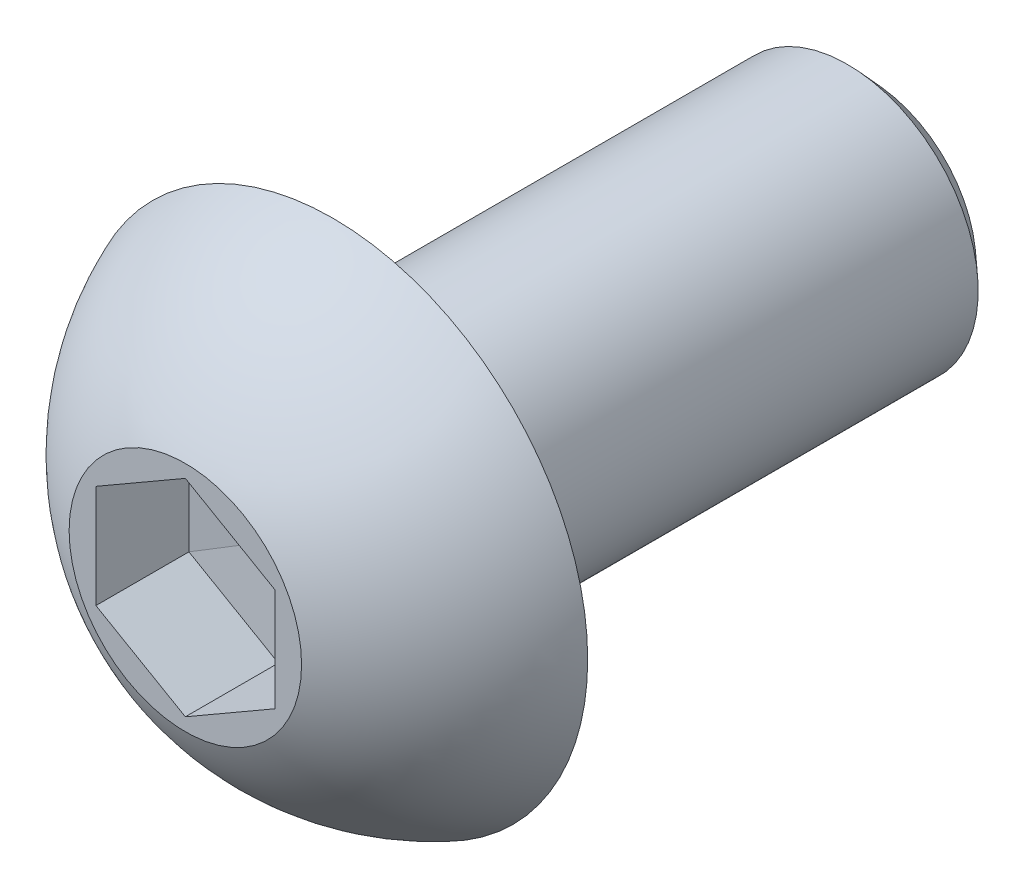
ISO-10303-21;
HEADER;
FILE_DESCRIPTION(('STEP AP214'),'2;1');
FILE_NAME('part.step','',(''),(''),'','','');
FILE_SCHEMA(('AUTOMOTIVE_DESIGN { 1 0 10303 214 1 1 1 1 }'));
ENDSEC;
DATA;
#1=APPLICATION_CONTEXT('core data for automotive mechanical design processes');
#2=APPLICATION_PROTOCOL_DEFINITION('international standard','automotive_design',2000,#1);
#3=PRODUCT_CONTEXT('',#1,'mechanical');
#4=PRODUCT('Part','Part','',(#3));
#5=PRODUCT_RELATED_PRODUCT_CATEGORY('part','',(#4));
#6=PRODUCT_DEFINITION_FORMATION('','',#4);
#7=PRODUCT_DEFINITION_CONTEXT('part definition',#1,'design');
#8=PRODUCT_DEFINITION('design','',#6,#7);
#9=PRODUCT_DEFINITION_SHAPE('','',#8);
#10=(LENGTH_UNIT() NAMED_UNIT(*) SI_UNIT(.MILLI.,.METRE.));
#11=(NAMED_UNIT(*) PLANE_ANGLE_UNIT() SI_UNIT($,.RADIAN.));
#12=(NAMED_UNIT(*) SI_UNIT($,.STERADIAN.) SOLID_ANGLE_UNIT());
#13=UNCERTAINTY_MEASURE_WITH_UNIT(LENGTH_MEASURE(1.E-05),#10,'distance_accuracy_value','');
#14=(GEOMETRIC_REPRESENTATION_CONTEXT(3) GLOBAL_UNCERTAINTY_ASSIGNED_CONTEXT((#13)) GLOBAL_UNIT_ASSIGNED_CONTEXT((#10,
#11,#12)) REPRESENTATION_CONTEXT('',''));
#15=CARTESIAN_POINT('',(0.,0.,0.));
#16=DIRECTION('',(0.,0.,1.));
#17=DIRECTION('',(1.,0.,0.));
#18=AXIS2_PLACEMENT_3D('',#15,#16,#17);
#19=CARTESIAN_POINT('',(0.,0.,-1.12424242424294));
#20=DIRECTION('',(0.,0.,1.));
#21=DIRECTION('',(1.,0.,0.));
#22=AXIS2_PLACEMENT_3D('',#19,#20,#21);
#23=SPHERICAL_SURFACE('',#22,3.06372665694355);
#24=CARTESIAN_POINT('',(0.,0.,-5.09960734214414E-13));
#25=DIRECTION('',(0.,0.,-1.));
#26=DIRECTION('',(1.,0.,0.));
#27=AXIS2_PLACEMENT_3D('',#24,#25,#26);
#28=CIRCLE('',#27,2.85);
#29=CARTESIAN_POINT('',(2.85,0.,-5.10659223240673E-13));
#30=VERTEX_POINT('',#29);
#31=EDGE_CURVE('E146',#30,#30,#28,.T.);
#32=CARTESIAN_POINT('',(0.,0.,1.64999999999949));
#33=DIRECTION('',(0.,0.,-1.));
#34=DIRECTION('',(1.,0.,0.));
#35=AXIS2_PLACEMENT_3D('',#32,#33,#34);
#36=CIRCLE('',#35,1.3);
#37=CARTESIAN_POINT('',(1.3,0.,1.64999999999949));
#38=VERTEX_POINT('',#37);
#39=EDGE_CURVE('E11',#38,#38,#36,.T.);
#40=CARTESIAN_POINT('',(2.85,0.,-5.10659223240673E-13));
#41=CARTESIAN_POINT('',(2.84113663386439,0.,0.0224691478443114));
#42=CARTESIAN_POINT('',(2.83200744713934,0.,0.0448334346416591));
#43=CARTESIAN_POINT('',(2.81322277135795,0.,0.0893398740639242));
#44=CARTESIAN_POINT('',(2.80356728230162,0.,0.111482026688841));
#45=CARTESIAN_POINT('',(2.7837353407053,0.,0.155531785688763));
#46=CARTESIAN_POINT('',(2.77355888816531,0.,0.177439392063768));
#47=CARTESIAN_POINT('',(2.75269072874913,0.,0.221007810980761));
#48=CARTESIAN_POINT('',(2.74199902187295,0.,0.24266862352275));
#49=CARTESIAN_POINT('',(2.7201063300164,0.,0.285731336320252));
#50=CARTESIAN_POINT('',(2.70890534503602,0.,0.307133236575766));
#51=CARTESIAN_POINT('',(2.68600036374538,0.,0.349666153566971));
#52=CARTESIAN_POINT('',(2.67429636743511,0.,0.370797170302663));
#53=CARTESIAN_POINT('',(2.65039191011457,0.,0.412776499906466));
#54=CARTESIAN_POINT('',(2.63819144910429,0.,0.433624812774579));
#55=CARTESIAN_POINT('',(2.61330088713136,0.,0.475027072605241));
#56=CARTESIAN_POINT('',(2.6006107861687,0.,0.495581019567789));
#57=CARTESIAN_POINT('',(2.57474804282317,0.,0.536383050164972));
#58=CARTESIAN_POINT('',(2.56157540044031,0.,0.556631133799606));
#59=CARTESIAN_POINT('',(2.53475494273848,0.,0.596810111423956));
#60=CARTESIAN_POINT('',(2.52110712741952,0.,0.616741005413671));
#61=CARTESIAN_POINT('',(2.49334395812279,0.,0.656274454856581));
#62=CARTESIAN_POINT('',(2.47922860414502,0.,0.675877010309776));
#63=CARTESIAN_POINT('',(2.45053825334057,0.,0.714742817454075));
#64=CARTESIAN_POINT('',(2.4359632565139,0.,0.734006069145179));
#65=CARTESIAN_POINT('',(2.40636177293482,0.,0.772182493338329));
#66=CARTESIAN_POINT('',(2.3913352861824,0.,0.791095665840376));
#67=CARTESIAN_POINT('',(2.36083922822839,0.,0.828561352054885));
#68=CARTESIAN_POINT('',(2.34536965702678,0.,0.847113865767347));
#69=CARTESIAN_POINT('',(2.31399608350231,0.,0.883847856546503));
#70=CARTESIAN_POINT('',(2.29809208117944,0.,0.902029333613197));
#71=CARTESIAN_POINT('',(2.2658585417513,0.,0.938011080794139));
#72=CARTESIAN_POINT('',(2.24952900464603,0.,0.955811350908387));
#73=CARTESIAN_POINT('',(2.21645353002648,0.,0.991020727116296));
#74=CARTESIAN_POINT('',(2.1997075925122,0.,1.00842983320996));
#75=CARTESIAN_POINT('',(2.16580868437298,0.,1.04284714311685));
#76=CARTESIAN_POINT('',(2.14865571374804,0.,1.05985534693008));
#77=CARTESIAN_POINT('',(2.11395233437096,0.,1.09346133827194));
#78=CARTESIAN_POINT('',(2.09640192561881,0.,1.11005912580056));
#79=CARTESIAN_POINT('',(2.06091348728868,0.,1.14283500014659));
#80=CARTESIAN_POINT('',(2.04297545771069,0.,1.15901308696401));
#81=CARTESIAN_POINT('',(2.00672181185651,0.,1.19094051023207));
#82=CARTESIAN_POINT('',(1.98840619558033,0.,1.20668984668272));
#83=CARTESIAN_POINT('',(1.95140762167093,0.,1.23775095939509));
#84=CARTESIAN_POINT('',(1.93272466403772,0.,1.25306273565682));
#85=CARTESIAN_POINT('',(1.89500185823761,0.,1.28324016292989));
#86=CARTESIAN_POINT('',(1.87596201007072,0.,1.29810581394125));
#87=CARTESIAN_POINT('',(1.83753607366409,0.,1.32738267520654));
#88=CARTESIAN_POINT('',(1.81814998542436,0.,1.34179388546048));
#89=CARTESIAN_POINT('',(1.77904241300796,0.,1.37015380390018));
#90=CARTESIAN_POINT('',(1.7593209288313,0.,1.38410251208594));
#91=CARTESIAN_POINT('',(1.71955359630399,0.,1.41152962382006));
#92=CARTESIAN_POINT('',(1.69950774795333,0.,1.42500802736843));
#93=CARTESIAN_POINT('',(1.65910290023023,0.,1.45148699023043));
#94=CARTESIAN_POINT('',(1.63874390085779,0.,1.46448754954408));
#95=CARTESIAN_POINT('',(1.59772413960959,0.,1.4900035520297));
#96=CARTESIAN_POINT('',(1.57706337773384,0.,1.50251899520168));
#97=CARTESIAN_POINT('',(1.5354516480626,0.,1.52705776338538));
#98=CARTESIAN_POINT('',(1.5145006802671,0.,1.53908108839711));
#99=CARTESIAN_POINT('',(1.47232026041398,0.,1.56262889902485));
#100=CARTESIAN_POINT('',(1.45109080835635,0.,1.57415338464086));
#101=CARTESIAN_POINT('',(1.40836528719074,0.,1.59669705374236));
#102=CARTESIAN_POINT('',(1.38686921808275,0.,1.60771623722784));
#103=CARTESIAN_POINT('',(1.34362251732278,0.,1.62924319863992));
#104=CARTESIAN_POINT('',(1.3218718856708,0.,1.63975097656652));
#105=CARTESIAN_POINT('',(1.3,0.,1.64999999999949));
#106=B_SPLINE_CURVE_WITH_KNOTS('',3,(#40,#41,#42,#43,#44,#45,#46,#47,#48,#49,#50,#51,#52,#53,
#54,#55,#56,#57,#58,#59,#60,#61,#62,#63,#64,#65,#66,#67,#68,#69,#70,#71,#72,#73,#74,#75,#76,#77,
#78,#79,#80,#81,#82,#83,#84,#85,#86,#87,#88,#89,#90,#91,#92,#93,#94,#95,#96,#97,#98,#99,#100,
#101,#102,#103,#104,#105),.UNSPECIFIED.,.F.,.F.,(4,2,2,2,2,2,2,2,2,2,2,2,2,2,2,2,2,2,2,2,2,2,2,
2,2,2,2,2,2,2,2,2,4),(0.,0.0724606888856509,0.144921377771302,0.217382066656953,
0.289842755542604,0.362303444428255,0.434764133313906,0.507224822199557,0.579685511085209,
0.652146199970859,0.72460688885651,0.797067577742162,0.869528266627813,0.941988955513463,
1.01444964439911,1.08691033328477,1.15937102217042,1.23183171105607,1.30429239994172,
1.37675308882737,1.44921377771302,1.52167446659867,1.59413515548432,1.66659584436997,
1.73905653325563,1.81151722214128,1.88397791102693,1.95643859991258,2.02889928879823,
2.10135997768388,2.17382066656953,2.24628135545518,2.31874204434083),.UNSPECIFIED.);
#107=EDGE_CURVE('BSEAM17',#30,#38,#106,.T.);
#108=ORIENTED_EDGE('',*,*,#31,.F.);
#109=ORIENTED_EDGE('',*,*,#39,.T.);
#110=ORIENTED_EDGE('',*,*,#107,.T.);
#111=ORIENTED_EDGE('',*,*,#107,.F.);
#112=EDGE_LOOP('',(#108,#110,#109,#111));
#113=FACE_BOUND('',#112,.T.);
#114=ADVANCED_FACE('F17',(#113),#23,.T.);
#115=CARTESIAN_POINT('',(-1.3,0.,1.64999999999949));
#116=DIRECTION('',(0.,0.,1.));
#117=DIRECTION('',(1.,0.,0.));
#118=AXIS2_PLACEMENT_3D('',#115,#116,#117);
#119=PLANE('',#118);
#120=DIRECTION('',(-0.866025403784439,-0.5,0.));
#121=VECTOR('',#120,1.);
#122=CARTESIAN_POINT('',(0.2625,-1.00314609271698,1.64999999999949));
#123=LINE('',#122,#121);
#124=CARTESIAN_POINT('',(1.,-0.577350269189626,1.65));
#125=VERTEX_POINT('',#124);
#126=CARTESIAN_POINT('',(0.,-1.15470053837925,1.65));
#127=VERTEX_POINT('',#126);
#128=EDGE_CURVE('E165',#125,#127,#123,.T.);
#129=ORIENTED_EDGE('',*,*,#128,.T.);
#130=DIRECTION('',(-0.866025403784439,0.5,0.));
#131=VECTOR('',#130,1.);
#132=CARTESIAN_POINT('',(-0.7375,-0.728904714851902,1.64999999999949));
#133=LINE('',#132,#131);
#134=CARTESIAN_POINT('',(-1.,-0.577350269189625,1.65));
#135=VERTEX_POINT('',#134);
#136=EDGE_CURVE('E20',#127,#135,#133,.T.);
#137=ORIENTED_EDGE('',*,*,#136,.T.);
#138=DIRECTION('',(0.,1.,0.));
#139=VECTOR('',#138,1.);
#140=CARTESIAN_POINT('',(-1.,-0.288675134594813,1.64999999999949));
#141=LINE('',#140,#139);
#142=CARTESIAN_POINT('',(-1.,0.577350269189626,1.65));
#143=VERTEX_POINT('',#142);
#144=EDGE_CURVE('E44',#135,#143,#141,.T.);
#145=ORIENTED_EDGE('',*,*,#144,.T.);
#146=DIRECTION('',(0.866025403784439,0.5,0.));
#147=VECTOR('',#146,1.);
#148=CARTESIAN_POINT('',(-1.2375,0.44022958025709,1.64999999999949));
#149=LINE('',#148,#147);
#150=CARTESIAN_POINT('',(0.,1.15470053837925,1.65));
#151=VERTEX_POINT('',#150);
#152=EDGE_CURVE('E186',#143,#151,#149,.T.);
#153=ORIENTED_EDGE('',*,*,#152,.T.);
#154=DIRECTION('',(0.866025403784439,-0.5,0.));
#155=VECTOR('',#154,1.);
#156=CARTESIAN_POINT('',(-0.2375,1.29182122731179,1.64999999999949));
#157=LINE('',#156,#155);
#158=CARTESIAN_POINT('',(1.,0.577350269189626,1.65));
#159=VERTEX_POINT('',#158);
#160=EDGE_CURVE('E180',#151,#159,#157,.T.);
#161=ORIENTED_EDGE('',*,*,#160,.T.);
#162=DIRECTION('',(0.,-1.,0.));
#163=VECTOR('',#162,1.);
#164=CARTESIAN_POINT('',(1.,0.288675134594813,1.64999999999949));
#165=LINE('',#164,#163);
#166=EDGE_CURVE('E174',#159,#125,#165,.T.);
#167=ORIENTED_EDGE('',*,*,#166,.T.);
#168=EDGE_LOOP('',(#129,#137,#145,#153,#161,#167));
#169=FACE_BOUND('',#168,.T.);
#170=ORIENTED_EDGE('',*,*,#39,.F.);
#171=EDGE_LOOP('',(#170));
#172=FACE_BOUND('',#171,.T.);
#173=ADVANCED_FACE('F379',(#169,#172),#119,.T.);
#174=CARTESIAN_POINT('',(0.,0.,-6.));
#175=DIRECTION('',(0.,0.,-1.));
#176=DIRECTION('',(-1.,0.,0.));
#177=AXIS2_PLACEMENT_3D('',#174,#175,#176);
#178=PLANE('',#177);
#179=CARTESIAN_POINT('',(0.,0.,-6.));
#180=DIRECTION('',(0.,0.,-1.));
#181=DIRECTION('',(-1.,0.,0.));
#182=AXIS2_PLACEMENT_3D('',#179,#180,#181);
#183=CIRCLE('',#182,1.193275);
#184=CARTESIAN_POINT('',(-1.193275,0.,-6.));
#185=VERTEX_POINT('',#184);
#186=EDGE_CURVE('E452',#185,#185,#183,.T.);
#187=ORIENTED_EDGE('',*,*,#186,.T.);
#188=EDGE_LOOP('',(#187));
#189=FACE_BOUND('',#188,.T.);
#190=ADVANCED_FACE('F368',(#189),#178,.T.);
#191=CARTESIAN_POINT('',(0.,-1.15470053837925,1.65));
#192=DIRECTION('',(-0.5,-0.866025403784439,0.));
#193=DIRECTION('',(-0.866025403784439,0.5,0.));
#194=AXIS2_PLACEMENT_3D('',#191,#192,#193);
#195=PLANE('',#194);
#196=ORIENTED_EDGE('',*,*,#136,.F.);
#197=DIRECTION('',(0.,0.,-1.));
#198=VECTOR('',#197,1.);
#199=CARTESIAN_POINT('',(0.,-1.15470053837925,1.65));
#200=LINE('',#199,#198);
#201=CARTESIAN_POINT('',(0.,-1.15470053837925,0.61));
#202=VERTEX_POINT('',#201);
#203=EDGE_CURVE('E171',#127,#202,#200,.T.);
#204=ORIENTED_EDGE('',*,*,#203,.T.);
#205=DIRECTION('',(-0.866025403784439,0.5,0.));
#206=VECTOR('',#205,1.);
#207=CARTESIAN_POINT('',(-1.,-0.577350269189625,0.61));
#208=LINE('',#207,#206);
#209=CARTESIAN_POINT('',(-1.,-0.577350269189625,0.61));
#210=VERTEX_POINT('',#209);
#211=EDGE_CURVE('E103',#202,#210,#208,.T.);
#212=ORIENTED_EDGE('',*,*,#211,.T.);
#213=DIRECTION('',(0.,0.,-1.));
#214=VECTOR('',#213,1.);
#215=CARTESIAN_POINT('',(-1.,-0.577350269189625,1.65));
#216=LINE('',#215,#214);
#217=EDGE_CURVE('E193',#135,#210,#216,.T.);
#218=ORIENTED_EDGE('',*,*,#217,.F.);
#219=EDGE_LOOP('',(#196,#204,#212,#218));
#220=FACE_BOUND('',#219,.T.);
#221=ADVANCED_FACE('F358',(#220),#195,.F.);
#222=CARTESIAN_POINT('',(-1.,-0.577350269189625,1.65));
#223=DIRECTION('',(-1.,0.,0.));
#224=DIRECTION('',(0.,0.,1.));
#225=AXIS2_PLACEMENT_3D('',#222,#223,#224);
#226=PLANE('',#225);
#227=ORIENTED_EDGE('',*,*,#144,.F.);
#228=ORIENTED_EDGE('',*,*,#217,.T.);
#229=DIRECTION('',(0.,1.,0.));
#230=VECTOR('',#229,1.);
#231=CARTESIAN_POINT('',(-1.,0.577350269189626,0.61));
#232=LINE('',#231,#230);
#233=CARTESIAN_POINT('',(-1.,0.577350269189626,0.61));
#234=VERTEX_POINT('',#233);
#235=EDGE_CURVE('E98',#210,#234,#232,.T.);
#236=ORIENTED_EDGE('',*,*,#235,.T.);
#237=DIRECTION('',(0.,0.,-1.));
#238=VECTOR('',#237,1.);
#239=CARTESIAN_POINT('',(-1.,0.577350269189626,1.65));
#240=LINE('',#239,#238);
#241=EDGE_CURVE('E189',#143,#234,#240,.T.);
#242=ORIENTED_EDGE('',*,*,#241,.F.);
#243=EDGE_LOOP('',(#227,#228,#236,#242));
#244=FACE_BOUND('',#243,.T.);
#245=ADVANCED_FACE('F348',(#244),#226,.F.);
#246=CARTESIAN_POINT('',(-1.,0.577350269189626,1.65));
#247=DIRECTION('',(-0.5,0.866025403784439,0.));
#248=DIRECTION('',(0.,0.,1.));
#249=AXIS2_PLACEMENT_3D('',#246,#247,#248);
#250=PLANE('',#249);
#251=ORIENTED_EDGE('',*,*,#152,.F.);
#252=ORIENTED_EDGE('',*,*,#241,.T.);
#253=DIRECTION('',(0.866025403784439,0.5,0.));
#254=VECTOR('',#253,1.);
#255=CARTESIAN_POINT('',(0.,1.15470053837925,0.61));
#256=LINE('',#255,#254);
#257=CARTESIAN_POINT('',(0.,1.15470053837925,0.61));
#258=VERTEX_POINT('',#257);
#259=EDGE_CURVE('E112',#234,#258,#256,.T.);
#260=ORIENTED_EDGE('',*,*,#259,.T.);
#261=DIRECTION('',(0.,0.,-1.));
#262=VECTOR('',#261,1.);
#263=CARTESIAN_POINT('',(0.,1.15470053837925,1.65));
#264=LINE('',#263,#262);
#265=EDGE_CURVE('E183',#151,#258,#264,.T.);
#266=ORIENTED_EDGE('',*,*,#265,.F.);
#267=EDGE_LOOP('',(#251,#252,#260,#266));
#268=FACE_BOUND('',#267,.T.);
#269=ADVANCED_FACE('F337',(#268),#250,.F.);
#270=CARTESIAN_POINT('',(0.,1.15470053837925,1.65));
#271=DIRECTION('',(0.5,0.866025403784439,0.));
#272=DIRECTION('',(0.,0.,-1.));
#273=AXIS2_PLACEMENT_3D('',#270,#271,#272);
#274=PLANE('',#273);
#275=ORIENTED_EDGE('',*,*,#160,.F.);
#276=ORIENTED_EDGE('',*,*,#265,.T.);
#277=DIRECTION('',(0.866025403784439,-0.5,0.));
#278=VECTOR('',#277,1.);
#279=CARTESIAN_POINT('',(1.,0.577350269189626,0.61));
#280=LINE('',#279,#278);
#281=CARTESIAN_POINT('',(1.,0.577350269189626,0.61));
#282=VERTEX_POINT('',#281);
#283=EDGE_CURVE('E122',#258,#282,#280,.T.);
#284=ORIENTED_EDGE('',*,*,#283,.T.);
#285=DIRECTION('',(0.,0.,-1.));
#286=VECTOR('',#285,1.);
#287=CARTESIAN_POINT('',(1.,0.577350269189626,1.65));
#288=LINE('',#287,#286);
#289=EDGE_CURVE('E177',#159,#282,#288,.T.);
#290=ORIENTED_EDGE('',*,*,#289,.F.);
#291=EDGE_LOOP('',(#275,#276,#284,#290));
#292=FACE_BOUND('',#291,.T.);
#293=ADVANCED_FACE('F326',(#292),#274,.F.);
#294=CARTESIAN_POINT('',(1.,0.577350269189626,1.65));
#295=DIRECTION('',(1.,0.,0.));
#296=DIRECTION('',(0.,1.,0.));
#297=AXIS2_PLACEMENT_3D('',#294,#295,#296);
#298=PLANE('',#297);
#299=ORIENTED_EDGE('',*,*,#166,.F.);
#300=ORIENTED_EDGE('',*,*,#289,.T.);
#301=DIRECTION('',(0.,-1.,0.));
#302=VECTOR('',#301,1.);
#303=CARTESIAN_POINT('',(1.,-0.577350269189626,0.61));
#304=LINE('',#303,#302);
#305=CARTESIAN_POINT('',(1.,-0.577350269189626,0.61));
#306=VERTEX_POINT('',#305);
#307=EDGE_CURVE('E132',#282,#306,#304,.T.);
#308=ORIENTED_EDGE('',*,*,#307,.T.);
#309=DIRECTION('',(0.,0.,-1.));
#310=VECTOR('',#309,1.);
#311=CARTESIAN_POINT('',(1.,-0.577350269189626,1.65));
#312=LINE('',#311,#310);
#313=EDGE_CURVE('E168',#125,#306,#312,.T.);
#314=ORIENTED_EDGE('',*,*,#313,.F.);
#315=EDGE_LOOP('',(#299,#300,#308,#314));
#316=FACE_BOUND('',#315,.T.);
#317=ADVANCED_FACE('F316',(#316),#298,.F.);
#318=CARTESIAN_POINT('',(1.,-0.577350269189626,1.65));
#319=DIRECTION('',(0.5,-0.866025403784439,0.));
#320=DIRECTION('',(0.,0.,-1.));
#321=AXIS2_PLACEMENT_3D('',#318,#319,#320);
#322=PLANE('',#321);
#323=ORIENTED_EDGE('',*,*,#128,.F.);
#324=ORIENTED_EDGE('',*,*,#313,.T.);
#325=DIRECTION('',(-0.866025403784439,-0.5,0.));
#326=VECTOR('',#325,1.);
#327=CARTESIAN_POINT('',(0.,-1.15470053837925,0.61));
#328=LINE('',#327,#326);
#329=EDGE_CURVE('E140',#306,#202,#328,.T.);
#330=ORIENTED_EDGE('',*,*,#329,.T.);
#331=ORIENTED_EDGE('',*,*,#203,.F.);
#332=EDGE_LOOP('',(#323,#324,#330,#331));
#333=FACE_BOUND('',#332,.T.);
#334=ADVANCED_FACE('F306',(#333),#322,.F.);
#335=CARTESIAN_POINT('',(-1.,-0.577350269189625,0.61));
#336=DIRECTION('',(-0.0435778713738291,-0.0754790873051733,-0.996194698091746));
#337=DIRECTION('',(0.,-0.997141949694317,0.0755508581011305));
#338=AXIS2_PLACEMENT_3D('',#335,#336,#337);
#339=PLANE('',#338);
#340=DIRECTION('',(0.863550259614423,0.498570974847158,-0.0755508581011305));
#341=VECTOR('',#340,1.);
#342=CARTESIAN_POINT('',(-0.751426983039954,-0.433836570934465,0.588252678957559));
#343=LINE('',#342,#341);
#344=CARTESIAN_POINT('',(0.,0.,0.522511336474076));
#345=VERTEX_POINT('',#344);
#346=EDGE_CURVE('E92',#210,#345,#343,.T.);
#347=ORIENTED_EDGE('',*,*,#346,.F.);
#348=ORIENTED_EDGE('',*,*,#211,.F.);
#349=DIRECTION('',(0.,0.997141949694317,-0.0755508581011306));
#350=VECTOR('',#349,1.);
#351=CARTESIAN_POINT('',(0.,-0.867673141868932,0.588252678957559));
#352=LINE('',#351,#350);
#353=EDGE_CURVE('E138',#202,#345,#352,.T.);
#354=ORIENTED_EDGE('',*,*,#353,.T.);
#355=EDGE_LOOP('',(#347,#348,#354));
#356=FACE_BOUND('',#355,.T.);
#357=ADVANCED_FACE('F143',(#356),#339,.F.);
#358=CARTESIAN_POINT('',(-1.,0.577350269189626,0.61));
#359=DIRECTION('',(-0.0871557427476581,0.,-0.996194698091746));
#360=DIRECTION('',(-0.996194698091746,0.,0.0871557427476581));
#361=AXIS2_PLACEMENT_3D('',#358,#359,#360);
#362=PLANE('',#361);
#363=DIRECTION('',(0.863550259614423,-0.498570974847159,-0.0755508581011305));
#364=VECTOR('',#363,1.);
#365=CARTESIAN_POINT('',(-0.751426983039954,0.433836570934466,0.588252678957559));
#366=LINE('',#365,#364);
#367=EDGE_CURVE('E95',#234,#345,#366,.T.);
#368=ORIENTED_EDGE('',*,*,#367,.F.);
#369=ORIENTED_EDGE('',*,*,#235,.F.);
#370=ORIENTED_EDGE('',*,*,#346,.T.);
#371=EDGE_LOOP('',(#368,#369,#370));
#372=FACE_BOUND('',#371,.T.);
#373=ADVANCED_FACE('F94',(#372),#362,.F.);
#374=CARTESIAN_POINT('',(0.,1.15470053837925,0.61));
#375=DIRECTION('',(-0.0435778713738291,0.0754790873051733,-0.996194698091746));
#376=DIRECTION('',(-0.999044587684655,0.,0.0437025378896691));
#377=AXIS2_PLACEMENT_3D('',#374,#375,#376);
#378=PLANE('',#377);
#379=DIRECTION('',(0.,-0.997141949694317,-0.0755508581011306));
#380=VECTOR('',#379,1.);
#381=CARTESIAN_POINT('',(0.,0.867673141868932,0.588252678957559));
#382=LINE('',#381,#380);
#383=EDGE_CURVE('E109',#258,#345,#382,.T.);
#384=ORIENTED_EDGE('',*,*,#383,.F.);
#385=ORIENTED_EDGE('',*,*,#259,.F.);
#386=ORIENTED_EDGE('',*,*,#367,.T.);
#387=EDGE_LOOP('',(#384,#385,#386));
#388=FACE_BOUND('',#387,.T.);
#389=ADVANCED_FACE('F108',(#388),#378,.F.);
#390=CARTESIAN_POINT('',(1.,0.577350269189626,0.61));
#391=DIRECTION('',(0.0435778713738291,0.0754790873051733,-0.996194698091746));
#392=DIRECTION('',(-0.999044587684655,0.,-0.0437025378896691));
#393=AXIS2_PLACEMENT_3D('',#390,#391,#392);
#394=PLANE('',#393);
#395=DIRECTION('',(-0.863550259614423,-0.498570974847158,-0.0755508581011305));
#396=VECTOR('',#395,1.);
#397=CARTESIAN_POINT('',(0.751426983039954,0.433836570934466,0.588252678957559));
#398=LINE('',#397,#396);
#399=EDGE_CURVE('E119',#282,#345,#398,.T.);
#400=ORIENTED_EDGE('',*,*,#399,.F.);
#401=ORIENTED_EDGE('',*,*,#283,.F.);
#402=ORIENTED_EDGE('',*,*,#383,.T.);
#403=EDGE_LOOP('',(#400,#401,#402));
#404=FACE_BOUND('',#403,.T.);
#405=ADVANCED_FACE('F118',(#404),#394,.F.);
#406=CARTESIAN_POINT('',(1.,-0.577350269189626,0.61));
#407=DIRECTION('',(0.0871557427476581,0.,-0.996194698091746));
#408=DIRECTION('',(0.,-1.,0.));
#409=AXIS2_PLACEMENT_3D('',#406,#407,#408);
#410=PLANE('',#409);
#411=DIRECTION('',(-0.863550259614423,0.498570974847158,-0.0755508581011305));
#412=VECTOR('',#411,1.);
#413=CARTESIAN_POINT('',(0.751426983039954,-0.433836570934466,0.588252678957559));
#414=LINE('',#413,#412);
#415=EDGE_CURVE('E129',#306,#345,#414,.T.);
#416=ORIENTED_EDGE('',*,*,#415,.F.);
#417=ORIENTED_EDGE('',*,*,#307,.F.);
#418=ORIENTED_EDGE('',*,*,#399,.T.);
#419=EDGE_LOOP('',(#416,#417,#418));
#420=FACE_BOUND('',#419,.T.);
#421=ADVANCED_FACE('F128',(#420),#410,.F.);
#422=CARTESIAN_POINT('',(0.,-1.15470053837925,0.61));
#423=DIRECTION('',(0.0435778713738291,-0.0754790873051733,-0.996194698091746));
#424=DIRECTION('',(0.,-0.997141949694317,0.0755508581011305));
#425=AXIS2_PLACEMENT_3D('',#422,#423,#424);
#426=PLANE('',#425);
#427=ORIENTED_EDGE('',*,*,#353,.F.);
#428=ORIENTED_EDGE('',*,*,#329,.F.);
#429=ORIENTED_EDGE('',*,*,#415,.T.);
#430=EDGE_LOOP('',(#427,#428,#429));
#431=FACE_BOUND('',#430,.T.);
#432=ADVANCED_FACE('F137',(#431),#426,.F.);
#433=CARTESIAN_POINT('',(0.,0.,-3.00000000000011));
#434=DIRECTION('',(0.,0.,-1.));
#435=DIRECTION('',(-1.,0.,0.));
#436=AXIS2_PLACEMENT_3D('',#433,#434,#435);
#437=CYLINDRICAL_SURFACE('',#436,1.4635);
#438=CARTESIAN_POINT('',(0.,0.,-0.300000000000217));
#439=DIRECTION('',(0.,0.,1.));
#440=DIRECTION('',(-1.,0.,0.));
#441=AXIS2_PLACEMENT_3D('',#438,#439,#440);
#442=CIRCLE('',#441,1.4635);
#443=CARTESIAN_POINT('',(-1.4635,0.,-0.300000000000217));
#444=VERTEX_POINT('',#443);
#445=EDGE_CURVE('E155',#444,#444,#442,.T.);
#446=ORIENTED_EDGE('',*,*,#445,.F.);
#447=EDGE_LOOP('',(#446));
#448=FACE_BOUND('',#447,.T.);
#449=CARTESIAN_POINT('',(0.,0.,-5.75385028398538));
#450=DIRECTION('',(0.,0.,1.));
#451=DIRECTION('',(-1.,0.,0.));
#452=AXIS2_PLACEMENT_3D('',#449,#450,#451);
#453=CIRCLE('',#452,1.4635);
#454=CARTESIAN_POINT('',(-1.4635,0.,-5.75385028398538));
#455=VERTEX_POINT('',#454);
#456=EDGE_CURVE('E472',#455,#455,#453,.T.);
#457=ORIENTED_EDGE('',*,*,#456,.T.);
#458=EDGE_LOOP('',(#457));
#459=FACE_BOUND('',#458,.T.);
#460=ADVANCED_FACE('F239',(#448,#459),#437,.T.);
#461=CARTESIAN_POINT('',(-1.5,0.,-2.17010089795198E-13));
#462=DIRECTION('',(0.,0.,-1.));
#463=DIRECTION('',(-1.,0.,0.));
#464=AXIS2_PLACEMENT_3D('',#461,#462,#463);
#465=PLANE('',#464);
#466=CARTESIAN_POINT('',(0.,0.,-2.17430240478933E-13));
#467=DIRECTION('',(0.,0.,-1.));
#468=DIRECTION('',(-1.,0.,0.));
#469=AXIS2_PLACEMENT_3D('',#466,#467,#468);
#470=CIRCLE('',#469,1.7635);
#471=CARTESIAN_POINT('',(-1.7635,0.,-2.16944690426707E-13));
#472=VERTEX_POINT('',#471);
#473=EDGE_CURVE('E459',#472,#472,#470,.T.);
#474=ORIENTED_EDGE('',*,*,#473,.F.);
#475=EDGE_LOOP('',(#474));
#476=FACE_BOUND('',#475,.T.);
#477=ORIENTED_EDGE('',*,*,#31,.T.);
#478=EDGE_LOOP('',(#477));
#479=FACE_BOUND('',#478,.T.);
#480=ADVANCED_FACE('F228',(#476,#479),#465,.T.);
#481=CARTESIAN_POINT('',(0.,0.,-0.300000000000217));
#482=DIRECTION('',(0.,0.,-1.));
#483=DIRECTION('',(-1.,0.,0.));
#484=AXIS2_PLACEMENT_3D('',#481,#482,#483);
#485=TOROIDAL_SURFACE('',#484,1.7635,0.3);
#486=ORIENTED_EDGE('',*,*,#445,.T.);
#487=EDGE_LOOP('',(#486));
#488=FACE_BOUND('',#487,.T.);
#489=ORIENTED_EDGE('',*,*,#473,.T.);
#490=EDGE_LOOP('',(#489));
#491=FACE_BOUND('',#490,.T.);
#492=ADVANCED_FACE('F215',(#488,#491),#485,.F.);
#493=CARTESIAN_POINT('',(0.,0.,-5.8466375));
#494=DIRECTION('',(0.,0.,1.));
#495=DIRECTION('',(-1.,0.,0.));
#496=AXIS2_PLACEMENT_3D('',#493,#494,#495);
#497=CONICAL_SURFACE('',#496,1.36163749999995,0.831988093682881);
#498=ORIENTED_EDGE('',*,*,#186,.F.);
#499=EDGE_LOOP('',(#498));
#500=FACE_BOUND('',#499,.T.);
#501=ORIENTED_EDGE('',*,*,#456,.F.);
#502=EDGE_LOOP('',(#501));
#503=FACE_BOUND('',#502,.T.);
#504=ADVANCED_FACE('F210',(#500,#503),#497,.T.);
#505=CLOSED_SHELL('',(#114,#173,#190,#221,#245,#269,#293,#317,#334,#357,#373,#389,#405,#421,
#432,#460,#480,#492,#504));
#506=MANIFOLD_SOLID_BREP('B1',#505);
#507=ADVANCED_BREP_SHAPE_REPRESENTATION('',(#18,#506),#14);
#508=SHAPE_DEFINITION_REPRESENTATION(#9,#507);
ENDSEC;
END-ISO-10303-21;
